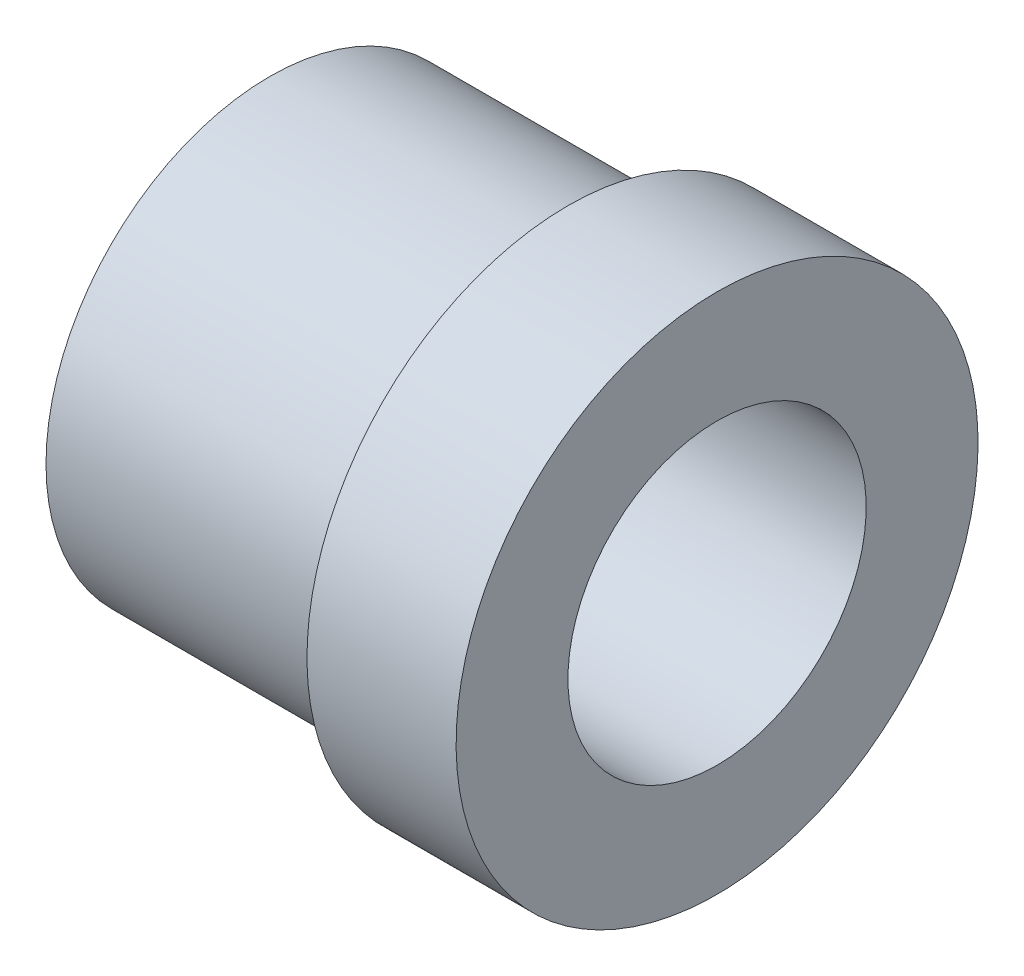
ISO-10303-21;
HEADER;
FILE_DESCRIPTION(('STEP AP214'),'2;1');
FILE_NAME('part.step','',(''),(''),'','','');
FILE_SCHEMA(('AUTOMOTIVE_DESIGN { 1 0 10303 214 1 1 1 1 }'));
ENDSEC;
DATA;
#1=APPLICATION_CONTEXT('core data for automotive mechanical design processes');
#2=APPLICATION_PROTOCOL_DEFINITION('international standard','automotive_design',2000,#1);
#3=PRODUCT_CONTEXT('',#1,'mechanical');
#4=PRODUCT('Part','Part','',(#3));
#5=PRODUCT_RELATED_PRODUCT_CATEGORY('part','',(#4));
#6=PRODUCT_DEFINITION_FORMATION('','',#4);
#7=PRODUCT_DEFINITION_CONTEXT('part definition',#1,'design');
#8=PRODUCT_DEFINITION('design','',#6,#7);
#9=PRODUCT_DEFINITION_SHAPE('','',#8);
#10=(LENGTH_UNIT() NAMED_UNIT(*) SI_UNIT(.MILLI.,.METRE.));
#11=(NAMED_UNIT(*) PLANE_ANGLE_UNIT() SI_UNIT($,.RADIAN.));
#12=(NAMED_UNIT(*) SI_UNIT($,.STERADIAN.) SOLID_ANGLE_UNIT());
#13=UNCERTAINTY_MEASURE_WITH_UNIT(LENGTH_MEASURE(1.E-05),#10,'distance_accuracy_value','');
#14=(GEOMETRIC_REPRESENTATION_CONTEXT(3) GLOBAL_UNCERTAINTY_ASSIGNED_CONTEXT((#13)) GLOBAL_UNIT_ASSIGNED_CONTEXT((#10,
#11,#12)) REPRESENTATION_CONTEXT('',''));
#15=CARTESIAN_POINT('',(0.,0.,0.));
#16=DIRECTION('',(0.,0.,1.));
#17=DIRECTION('',(1.,0.,0.));
#18=AXIS2_PLACEMENT_3D('',#15,#16,#17);
#19=CARTESIAN_POINT('',(-6.,0.,0.));
#20=DIRECTION('',(-1.,0.,0.));
#21=DIRECTION('',(0.,-1.,0.));
#22=AXIS2_PLACEMENT_3D('',#19,#20,#21);
#23=PLANE('',#22);
#24=CARTESIAN_POINT('',(-6.,0.,0.));
#25=DIRECTION('',(1.,0.,0.));
#26=DIRECTION('',(0.,1.,0.));
#27=AXIS2_PLACEMENT_3D('',#24,#25,#26);
#28=CIRCLE('',#27,2.);
#29=CARTESIAN_POINT('',(-6.,2.,0.));
#30=VERTEX_POINT('',#29);
#31=EDGE_CURVE('E64',#30,#30,#28,.T.);
#32=ORIENTED_EDGE('',*,*,#31,.T.);
#33=EDGE_LOOP('',(#32));
#34=FACE_BOUND('',#33,.T.);
#35=CARTESIAN_POINT('',(-6.,0.,0.));
#36=DIRECTION('',(1.,0.,0.));
#37=DIRECTION('',(0.,1.,0.));
#38=AXIS2_PLACEMENT_3D('',#35,#36,#37);
#39=CIRCLE('',#38,3.);
#40=CARTESIAN_POINT('',(-6.,3.,0.));
#41=VERTEX_POINT('',#40);
#42=EDGE_CURVE('E10',#41,#41,#39,.T.);
#43=ORIENTED_EDGE('',*,*,#42,.F.);
#44=EDGE_LOOP('',(#43));
#45=FACE_BOUND('',#44,.T.);
#46=ADVANCED_FACE('F41',(#34,#45),#23,.T.);
#47=CARTESIAN_POINT('',(0.,0.,0.));
#48=DIRECTION('',(1.,0.,0.));
#49=DIRECTION('',(0.,1.,0.));
#50=AXIS2_PLACEMENT_3D('',#47,#48,#49);
#51=CYLINDRICAL_SURFACE('',#50,3.);
#52=ORIENTED_EDGE('',*,*,#42,.T.);
#53=EDGE_LOOP('',(#52));
#54=FACE_BOUND('',#53,.T.);
#55=CARTESIAN_POINT('',(-2.,0.,0.));
#56=DIRECTION('',(1.,0.,0.));
#57=DIRECTION('',(0.,1.,0.));
#58=AXIS2_PLACEMENT_3D('',#55,#56,#57);
#59=CIRCLE('',#58,3.);
#60=CARTESIAN_POINT('',(-2.,3.,0.));
#61=VERTEX_POINT('',#60);
#62=EDGE_CURVE('E48',#61,#61,#59,.T.);
#63=ORIENTED_EDGE('',*,*,#62,.F.);
#64=EDGE_LOOP('',(#63));
#65=FACE_BOUND('',#64,.T.);
#66=ADVANCED_FACE('F95',(#54,#65),#51,.T.);
#67=CARTESIAN_POINT('',(-2.,3.,0.));
#68=DIRECTION('',(-1.,0.,0.));
#69=DIRECTION('',(0.,-1.,0.));
#70=AXIS2_PLACEMENT_3D('',#67,#68,#69);
#71=PLANE('',#70);
#72=ORIENTED_EDGE('',*,*,#62,.T.);
#73=EDGE_LOOP('',(#72));
#74=FACE_BOUND('',#73,.T.);
#75=CARTESIAN_POINT('',(-2.,0.,0.));
#76=DIRECTION('',(1.,0.,0.));
#77=DIRECTION('',(0.,1.,0.));
#78=AXIS2_PLACEMENT_3D('',#75,#76,#77);
#79=CIRCLE('',#78,3.5);
#80=CARTESIAN_POINT('',(-2.,3.5,0.));
#81=VERTEX_POINT('',#80);
#82=EDGE_CURVE('E53',#81,#81,#79,.T.);
#83=ORIENTED_EDGE('',*,*,#82,.F.);
#84=EDGE_LOOP('',(#83));
#85=FACE_BOUND('',#84,.T.);
#86=ADVANCED_FACE('F89',(#74,#85),#71,.T.);
#87=CARTESIAN_POINT('',(0.,0.,0.));
#88=DIRECTION('',(1.,0.,0.));
#89=DIRECTION('',(0.,1.,0.));
#90=AXIS2_PLACEMENT_3D('',#87,#88,#89);
#91=CYLINDRICAL_SURFACE('',#90,3.5);
#92=ORIENTED_EDGE('',*,*,#82,.T.);
#93=EDGE_LOOP('',(#92));
#94=FACE_BOUND('',#93,.T.);
#95=CARTESIAN_POINT('',(0.,0.,0.));
#96=DIRECTION('',(1.,0.,0.));
#97=DIRECTION('',(0.,1.,0.));
#98=AXIS2_PLACEMENT_3D('',#95,#96,#97);
#99=CIRCLE('',#98,3.5);
#100=CARTESIAN_POINT('',(0.,3.5,0.));
#101=VERTEX_POINT('',#100);
#102=EDGE_CURVE('E58',#101,#101,#99,.T.);
#103=ORIENTED_EDGE('',*,*,#102,.F.);
#104=EDGE_LOOP('',(#103));
#105=FACE_BOUND('',#104,.T.);
#106=ADVANCED_FACE('F84',(#94,#105),#91,.T.);
#107=CARTESIAN_POINT('',(0.,3.5,0.));
#108=DIRECTION('',(1.,0.,0.));
#109=DIRECTION('',(0.,1.,0.));
#110=AXIS2_PLACEMENT_3D('',#107,#108,#109);
#111=PLANE('',#110);
#112=CARTESIAN_POINT('',(0.,0.,0.));
#113=DIRECTION('',(1.,0.,0.));
#114=DIRECTION('',(0.,1.,0.));
#115=AXIS2_PLACEMENT_3D('',#112,#113,#114);
#116=CIRCLE('',#115,2.);
#117=CARTESIAN_POINT('',(0.,2.,0.));
#118=VERTEX_POINT('',#117);
#119=EDGE_CURVE('E65',#118,#118,#116,.T.);
#120=ORIENTED_EDGE('',*,*,#119,.F.);
#121=EDGE_LOOP('',(#120));
#122=FACE_BOUND('',#121,.T.);
#123=ORIENTED_EDGE('',*,*,#102,.T.);
#124=EDGE_LOOP('',(#123));
#125=FACE_BOUND('',#124,.T.);
#126=ADVANCED_FACE('F78',(#122,#125),#111,.T.);
#127=CARTESIAN_POINT('',(-6.,0.,0.));
#128=DIRECTION('',(1.,0.,0.));
#129=DIRECTION('',(0.,1.,0.));
#130=AXIS2_PLACEMENT_3D('',#127,#128,#129);
#131=CYLINDRICAL_SURFACE('',#130,2.);
#132=CARTESIAN_POINT('',(-6.,2.,0.));
#133=CARTESIAN_POINT('',(-5.9375,2.,0.));
#134=CARTESIAN_POINT('',(-5.875,2.,0.));
#135=CARTESIAN_POINT('',(-5.75,2.,0.));
#136=CARTESIAN_POINT('',(-5.6875,2.,0.));
#137=CARTESIAN_POINT('',(-5.5625,2.,0.));
#138=CARTESIAN_POINT('',(-5.5,2.,0.));
#139=CARTESIAN_POINT('',(-5.375,2.,0.));
#140=CARTESIAN_POINT('',(-5.3125,2.,0.));
#141=CARTESIAN_POINT('',(-5.1875,2.,0.));
#142=CARTESIAN_POINT('',(-5.125,2.,0.));
#143=CARTESIAN_POINT('',(-5.,2.,0.));
#144=CARTESIAN_POINT('',(-4.9375,2.,0.));
#145=CARTESIAN_POINT('',(-4.8125,2.,0.));
#146=CARTESIAN_POINT('',(-4.75,2.,0.));
#147=CARTESIAN_POINT('',(-4.625,2.,0.));
#148=CARTESIAN_POINT('',(-4.5625,2.,0.));
#149=CARTESIAN_POINT('',(-4.4375,2.,0.));
#150=CARTESIAN_POINT('',(-4.375,2.,0.));
#151=CARTESIAN_POINT('',(-4.25,2.,0.));
#152=CARTESIAN_POINT('',(-4.1875,2.,0.));
#153=CARTESIAN_POINT('',(-4.0625,2.,0.));
#154=CARTESIAN_POINT('',(-4.,2.,0.));
#155=CARTESIAN_POINT('',(-3.875,2.,0.));
#156=CARTESIAN_POINT('',(-3.8125,2.,0.));
#157=CARTESIAN_POINT('',(-3.6875,2.,0.));
#158=CARTESIAN_POINT('',(-3.625,2.,0.));
#159=CARTESIAN_POINT('',(-3.5,2.,0.));
#160=CARTESIAN_POINT('',(-3.4375,2.,0.));
#161=CARTESIAN_POINT('',(-3.3125,2.,0.));
#162=CARTESIAN_POINT('',(-3.25,2.,0.));
#163=CARTESIAN_POINT('',(-3.125,2.,0.));
#164=CARTESIAN_POINT('',(-3.0625,2.,0.));
#165=CARTESIAN_POINT('',(-2.9375,2.,0.));
#166=CARTESIAN_POINT('',(-2.875,2.,0.));
#167=CARTESIAN_POINT('',(-2.75,2.,0.));
#168=CARTESIAN_POINT('',(-2.6875,2.,0.));
#169=CARTESIAN_POINT('',(-2.5625,2.,0.));
#170=CARTESIAN_POINT('',(-2.5,2.,0.));
#171=CARTESIAN_POINT('',(-2.375,2.,0.));
#172=CARTESIAN_POINT('',(-2.3125,2.,0.));
#173=CARTESIAN_POINT('',(-2.1875,2.,0.));
#174=CARTESIAN_POINT('',(-2.125,2.,0.));
#175=CARTESIAN_POINT('',(-2.,2.,0.));
#176=CARTESIAN_POINT('',(-1.9375,2.,0.));
#177=CARTESIAN_POINT('',(-1.8125,2.,0.));
#178=CARTESIAN_POINT('',(-1.75,2.,0.));
#179=CARTESIAN_POINT('',(-1.625,2.,0.));
#180=CARTESIAN_POINT('',(-1.5625,2.,0.));
#181=CARTESIAN_POINT('',(-1.4375,2.,0.));
#182=CARTESIAN_POINT('',(-1.375,2.,0.));
#183=CARTESIAN_POINT('',(-1.25,2.,0.));
#184=CARTESIAN_POINT('',(-1.1875,2.,0.));
#185=CARTESIAN_POINT('',(-1.0625,2.,0.));
#186=CARTESIAN_POINT('',(-1.,2.,0.));
#187=CARTESIAN_POINT('',(-0.875,2.,0.));
#188=CARTESIAN_POINT('',(-0.8125,2.,0.));
#189=CARTESIAN_POINT('',(-0.687500000000001,2.,0.));
#190=CARTESIAN_POINT('',(-0.625000000000001,2.,0.));
#191=CARTESIAN_POINT('',(-0.5,2.,0.));
#192=CARTESIAN_POINT('',(-0.4375,2.,0.));
#193=CARTESIAN_POINT('',(-0.3125,2.,0.));
#194=CARTESIAN_POINT('',(-0.25,2.,0.));
#195=CARTESIAN_POINT('',(-0.125,2.,0.));
#196=CARTESIAN_POINT('',(-0.0625000000000001,2.,0.));
#197=CARTESIAN_POINT('',(0.,2.,0.));
#198=B_SPLINE_CURVE_WITH_KNOTS('',3,(#132,#133,#134,#135,#136,#137,#138,#139,#140,#141,#142,
#143,#144,#145,#146,#147,#148,#149,#150,#151,#152,#153,#154,#155,#156,#157,#158,#159,#160,#161,
#162,#163,#164,#165,#166,#167,#168,#169,#170,#171,#172,#173,#174,#175,#176,#177,#178,#179,#180,
#181,#182,#183,#184,#185,#186,#187,#188,#189,#190,#191,#192,#193,#194,#195,#196,#197),
.UNSPECIFIED.,.F.,.F.,(4,2,2,2,2,2,2,2,2,2,2,2,2,2,2,2,2,2,2,2,2,2,2,2,2,2,2,2,2,2,2,2,4),(0.,
0.187499999999999,0.374999999999999,0.5625,0.75,0.9375,1.125,1.3125,1.5,1.6875,1.875,2.0625,
2.25,2.4375,2.625,2.8125,3.,3.1875,3.375,3.5625,3.75,3.9375,4.125,4.3125,4.5,4.6875,4.875,
5.0625,5.25,5.4375,5.625,5.8125,6.),.UNSPECIFIED.);
#199=EDGE_CURVE('BSEAM75',#30,#118,#198,.T.);
#200=ORIENTED_EDGE('',*,*,#31,.F.);
#201=ORIENTED_EDGE('',*,*,#119,.T.);
#202=ORIENTED_EDGE('',*,*,#199,.T.);
#203=ORIENTED_EDGE('',*,*,#199,.F.);
#204=EDGE_LOOP('',(#200,#202,#201,#203));
#205=FACE_BOUND('',#204,.T.);
#206=ADVANCED_FACE('F75',(#205),#131,.F.);
#207=CLOSED_SHELL('',(#46,#66,#86,#106,#126,#206));
#208=MANIFOLD_SOLID_BREP('B2',#207);
#209=ADVANCED_BREP_SHAPE_REPRESENTATION('',(#18,#208),#14);
#210=SHAPE_DEFINITION_REPRESENTATION(#9,#209);
ENDSEC;
END-ISO-10303-21;
